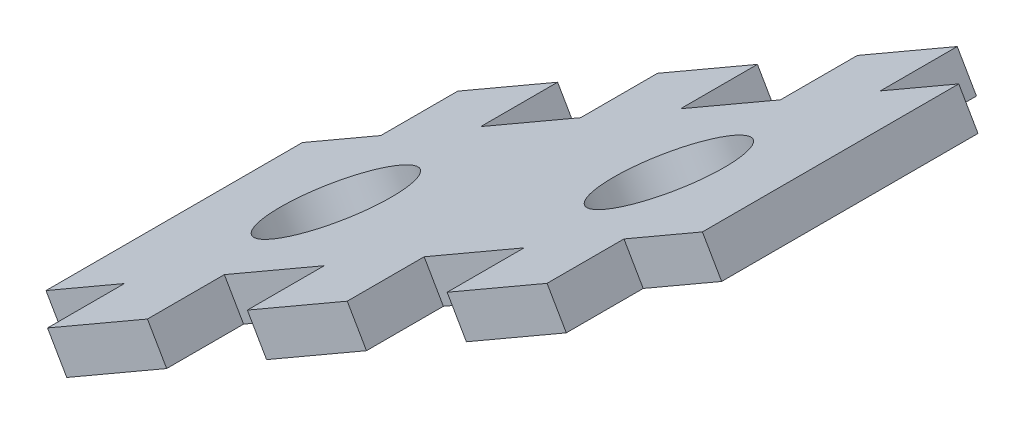
ISO-10303-21;
HEADER;
FILE_DESCRIPTION(('STEP AP214'),'2;1');
FILE_NAME('part.step','',(''),(''),'','','');
FILE_SCHEMA(('AUTOMOTIVE_DESIGN { 1 0 10303 214 1 1 1 1 }'));
ENDSEC;
DATA;
#1=APPLICATION_CONTEXT('core data for automotive mechanical design processes');
#2=APPLICATION_PROTOCOL_DEFINITION('international standard','automotive_design',2000,#1);
#3=PRODUCT_CONTEXT('',#1,'mechanical');
#4=PRODUCT('Part','Part','',(#3));
#5=PRODUCT_RELATED_PRODUCT_CATEGORY('part','',(#4));
#6=PRODUCT_DEFINITION_FORMATION('','',#4);
#7=PRODUCT_DEFINITION_CONTEXT('part definition',#1,'design');
#8=PRODUCT_DEFINITION('design','',#6,#7);
#9=PRODUCT_DEFINITION_SHAPE('','',#8);
#10=(LENGTH_UNIT() NAMED_UNIT(*) SI_UNIT(.MILLI.,.METRE.));
#11=(NAMED_UNIT(*) PLANE_ANGLE_UNIT() SI_UNIT($,.RADIAN.));
#12=(NAMED_UNIT(*) SI_UNIT($,.STERADIAN.) SOLID_ANGLE_UNIT());
#13=UNCERTAINTY_MEASURE_WITH_UNIT(LENGTH_MEASURE(1.E-05),#10,'distance_accuracy_value','');
#14=(GEOMETRIC_REPRESENTATION_CONTEXT(3) GLOBAL_UNCERTAINTY_ASSIGNED_CONTEXT((#13)) GLOBAL_UNIT_ASSIGNED_CONTEXT((#10,
#11,#12)) REPRESENTATION_CONTEXT('',''));
#15=CARTESIAN_POINT('',(0.,0.,0.));
#16=DIRECTION('',(0.,0.,1.));
#17=DIRECTION('',(1.,0.,0.));
#18=AXIS2_PLACEMENT_3D('',#15,#16,#17);
#19=CARTESIAN_POINT('',(0.,0.,0.));
#20=DIRECTION('',(0.,0.,1.));
#21=DIRECTION('',(1.,0.,0.));
#22=AXIS2_PLACEMENT_3D('',#19,#20,#21);
#23=PLANE('',#22);
#24=DIRECTION('',(0.500000000000002,-0.866025403784438,0.));
#25=VECTOR('',#24,1.);
#26=CARTESIAN_POINT('',(-139.580813944551,-80.5870205045939,0.));
#27=LINE('',#26,#25);
#28=CARTESIAN_POINT('',(-54.5936546228741,-227.789098440688,0.));
#29=VERTEX_POINT('',#28);
#30=CARTESIAN_POINT('',(-51.5936546228741,-232.985250863395,0.));
#31=VERTEX_POINT('',#30);
#32=EDGE_CURVE('E286',#29,#31,#27,.T.);
#33=ORIENTED_EDGE('',*,*,#32,.F.);
#34=DIRECTION('',(-0.866025403784438,-0.5,0.));
#35=VECTOR('',#34,1.);
#36=CARTESIAN_POINT('',(-82.4219374413873,-243.855765017042,0.));
#37=LINE('',#36,#35);
#38=CARTESIAN_POINT('',(-39.0051973547542,-218.789098440688,0.));
#39=VERTEX_POINT('',#38);
#40=EDGE_CURVE('E462',#39,#29,#37,.T.);
#41=ORIENTED_EDGE('',*,*,#40,.F.);
#42=DIRECTION('',(-0.500000000000001,0.866025403784438,0.));
#43=VECTOR('',#42,1.);
#44=CARTESIAN_POINT('',(-123.992356676431,-71.5870205045937,0.));
#45=LINE('',#44,#43);
#46=CARTESIAN_POINT('',(-36.0051973547542,-223.985250863395,0.));
#47=VERTEX_POINT('',#46);
#48=EDGE_CURVE('E333',#47,#39,#45,.T.);
#49=ORIENTED_EDGE('',*,*,#48,.F.);
#50=DIRECTION('',(0.866025403784439,0.5,0.));
#51=VECTOR('',#50,1.);
#52=CARTESIAN_POINT('',(-79.4219374413873,-249.051917439748,0.));
#53=LINE('',#52,#51);
#54=EDGE_CURVE('E54',#31,#47,#53,.T.);
#55=ORIENTED_EDGE('',*,*,#54,.F.);
#56=EDGE_LOOP('',(#33,#41,#49,#55));
#57=FACE_BOUND('',#56,.T.);
#58=ADVANCED_FACE('F39',(#57),#23,.F.);
#59=DIRECTION('',(-0.500000000000001,0.866025403784438,0.));
#60=VECTOR('',#59,1.);
#61=CARTESIAN_POINT('',(-155.169271212671,-89.5870205045936,0.));
#62=LINE('',#61,#60);
#63=CARTESIAN_POINT('',(-67.182111890994,-241.985250863395,0.));
#64=VERTEX_POINT('',#63);
#65=CARTESIAN_POINT('',(-70.182111890994,-236.789098440688,0.));
#66=VERTEX_POINT('',#65);
#67=EDGE_CURVE('E62',#64,#66,#62,.T.);
#68=ORIENTED_EDGE('',*,*,#67,.F.);
#69=CARTESIAN_POINT('',(-79.4219374413873,-249.051917439748,0.));
#70=VERTEX_POINT('',#69);
#71=EDGE_CURVE('E390',#70,#64,#53,.T.);
#72=ORIENTED_EDGE('',*,*,#71,.F.);
#73=DIRECTION('',(0.499999999999999,-0.866025403784439,0.));
#74=VECTOR('',#73,1.);
#75=CARTESIAN_POINT('',(-82.4219374413873,-243.855765017042,0.));
#76=LINE('',#75,#74);
#77=CARTESIAN_POINT('',(-82.4219374413873,-243.855765017042,0.));
#78=VERTEX_POINT('',#77);
#79=EDGE_CURVE('E393',#78,#70,#76,.T.);
#80=ORIENTED_EDGE('',*,*,#79,.F.);
#81=EDGE_CURVE('E384',#66,#78,#37,.T.);
#82=ORIENTED_EDGE('',*,*,#81,.F.);
#83=EDGE_LOOP('',(#68,#72,#80,#82));
#84=FACE_BOUND('',#83,.T.);
#85=ADVANCED_FACE('F473',(#84),#23,.F.);
#86=CARTESIAN_POINT('',(-1.78470181689456E-13,-160.,40.0000000000036));
#87=DIRECTION('',(0.,0.,1.));
#88=DIRECTION('',(-1.,0.,0.));
#89=AXIS2_PLACEMENT_3D('',#86,#87,#88);
#90=PLANE('',#89);
#91=DIRECTION('',(-0.866025403784439,-0.5,0.));
#92=VECTOR('',#91,1.);
#93=CARTESIAN_POINT('',(-82.4219374413872,-243.855765017042,40.0000000000035));
#94=LINE('',#93,#92);
#95=CARTESIAN_POINT('',(-39.0051973547542,-218.789098440688,40.0000000000035));
#96=VERTEX_POINT('',#95);
#97=CARTESIAN_POINT('',(-54.5936546228741,-227.789098440688,40.0000000000035));
#98=VERTEX_POINT('',#97);
#99=EDGE_CURVE('E426',#96,#98,#94,.T.);
#100=ORIENTED_EDGE('',*,*,#99,.T.);
#101=DIRECTION('',(0.500000000000002,-0.866025403784438,0.));
#102=VECTOR('',#101,1.);
#103=CARTESIAN_POINT('',(-70.2987816417955,-200.587020504594,40.0000000000035));
#104=LINE('',#103,#102);
#105=CARTESIAN_POINT('',(-51.5936546228741,-232.985250863395,40.0000000000035));
#106=VERTEX_POINT('',#105);
#107=EDGE_CURVE('E230',#98,#106,#104,.T.);
#108=ORIENTED_EDGE('',*,*,#107,.T.);
#109=DIRECTION('',(0.866025403784439,0.5,0.));
#110=VECTOR('',#109,1.);
#111=CARTESIAN_POINT('',(-79.4219374413872,-249.051917439748,40.0000000000035));
#112=LINE('',#111,#110);
#113=CARTESIAN_POINT('',(-36.0051973547542,-223.985250863395,40.0000000000035));
#114=VERTEX_POINT('',#113);
#115=EDGE_CURVE('E403',#106,#114,#112,.T.);
#116=ORIENTED_EDGE('',*,*,#115,.T.);
#117=DIRECTION('',(-0.500000000000001,0.866025403784438,0.));
#118=VECTOR('',#117,1.);
#119=CARTESIAN_POINT('',(-54.7103243736757,-191.587020504594,40.0000000000035));
#120=LINE('',#119,#118);
#121=EDGE_CURVE('E331',#114,#96,#120,.T.);
#122=ORIENTED_EDGE('',*,*,#121,.T.);
#123=EDGE_LOOP('',(#100,#108,#116,#122));
#124=FACE_BOUND('',#123,.T.);
#125=ADVANCED_FACE('F497',(#124),#90,.T.);
#126=CARTESIAN_POINT('',(-79.4219374413873,-249.051917439748,40.0000000000035));
#127=VERTEX_POINT('',#126);
#128=CARTESIAN_POINT('',(-67.182111890994,-241.985250863395,40.0000000000035));
#129=VERTEX_POINT('',#128);
#130=EDGE_CURVE('E400',#127,#129,#112,.T.);
#131=ORIENTED_EDGE('',*,*,#130,.T.);
#132=DIRECTION('',(-0.500000000000001,0.866025403784438,0.));
#133=VECTOR('',#132,1.);
#134=CARTESIAN_POINT('',(-85.8872389099154,-209.587020504594,40.0000000000035));
#135=LINE('',#134,#133);
#136=CARTESIAN_POINT('',(-70.182111890994,-236.789098440688,40.0000000000035));
#137=VERTEX_POINT('',#136);
#138=EDGE_CURVE('E281',#129,#137,#135,.T.);
#139=ORIENTED_EDGE('',*,*,#138,.T.);
#140=CARTESIAN_POINT('',(-82.4219374413873,-243.855765017042,40.0000000000035));
#141=VERTEX_POINT('',#140);
#142=EDGE_CURVE('E382',#137,#141,#94,.T.);
#143=ORIENTED_EDGE('',*,*,#142,.T.);
#144=DIRECTION('',(0.499999999999999,-0.866025403784439,0.));
#145=VECTOR('',#144,1.);
#146=CARTESIAN_POINT('',(-82.4219374413873,-243.855765017042,40.0000000000035));
#147=LINE('',#146,#145);
#148=EDGE_CURVE('E405',#141,#127,#147,.T.);
#149=ORIENTED_EDGE('',*,*,#148,.T.);
#150=EDGE_LOOP('',(#131,#139,#143,#149));
#151=FACE_BOUND('',#150,.T.);
#152=ADVANCED_FACE('F502',(#151),#90,.T.);
#153=DIRECTION('',(0.5,-0.866025403784439,0.));
#154=VECTOR('',#153,1.);
#155=CARTESIAN_POINT('',(-77.2269848720711,-44.5870205045934,0.));
#156=LINE('',#155,#154);
#157=CARTESIAN_POINT('',(7.76017444960544,-191.789098440688,0.));
#158=VERTEX_POINT('',#157);
#159=CARTESIAN_POINT('',(10.7601744496055,-196.985250863395,0.));
#160=VERTEX_POINT('',#159);
#161=EDGE_CURVE('E375',#158,#160,#156,.T.);
#162=ORIENTED_EDGE('',*,*,#161,.F.);
#163=CARTESIAN_POINT('',(19.9999999999987,-184.722431864335,0.));
#164=VERTEX_POINT('',#163);
#165=EDGE_CURVE('E379',#164,#158,#37,.T.);
#166=ORIENTED_EDGE('',*,*,#165,.F.);
#167=DIRECTION('',(-0.500000000000001,0.866025403784438,0.));
#168=VECTOR('',#167,1.);
#169=CARTESIAN_POINT('',(19.9999999999987,-184.722431864335,0.));
#170=LINE('',#169,#168);
#171=CARTESIAN_POINT('',(22.9999999999987,-189.918584287041,0.));
#172=VERTEX_POINT('',#171);
#173=EDGE_CURVE('E385',#172,#164,#170,.T.);
#174=ORIENTED_EDGE('',*,*,#173,.F.);
#175=EDGE_CURVE('E392',#160,#172,#53,.T.);
#176=ORIENTED_EDGE('',*,*,#175,.F.);
#177=EDGE_LOOP('',(#162,#166,#174,#176));
#178=FACE_BOUND('',#177,.T.);
#179=ADVANCED_FACE('F493',(#178),#23,.F.);
#180=CARTESIAN_POINT('',(-20.4167400866343,-214.985250863395,0.));
#181=VERTEX_POINT('',#180);
#182=CARTESIAN_POINT('',(-4.82828281851438,-205.985250863395,0.));
#183=VERTEX_POINT('',#182);
#184=EDGE_CURVE('E450',#181,#183,#53,.T.);
#185=ORIENTED_EDGE('',*,*,#184,.F.);
#186=DIRECTION('',(-0.499999999999999,0.866025403784439,0.));
#187=VECTOR('',#186,1.);
#188=CARTESIAN_POINT('',(-108.403899408311,-62.5870205045933,0.));
#189=LINE('',#188,#187);
#190=CARTESIAN_POINT('',(-23.4167400866343,-209.789098440688,0.));
#191=VERTEX_POINT('',#190);
#192=EDGE_CURVE('E328',#181,#191,#189,.T.);
#193=ORIENTED_EDGE('',*,*,#192,.T.);
#194=CARTESIAN_POINT('',(-7.82828281851439,-200.789098440688,0.));
#195=VERTEX_POINT('',#194);
#196=EDGE_CURVE('E383',#195,#191,#37,.T.);
#197=ORIENTED_EDGE('',*,*,#196,.F.);
#198=DIRECTION('',(-0.499999999999999,0.86602540378444,0.));
#199=VECTOR('',#198,1.);
#200=CARTESIAN_POINT('',(-92.8154421401909,-53.5870205045931,0.));
#201=LINE('',#200,#199);
#202=EDGE_CURVE('E361',#183,#195,#201,.T.);
#203=ORIENTED_EDGE('',*,*,#202,.F.);
#204=EDGE_LOOP('',(#185,#193,#197,#203));
#205=FACE_BOUND('',#204,.T.);
#206=ADVANCED_FACE('F498',(#205),#23,.F.);
#207=CARTESIAN_POINT('',(19.9999999999987,-184.722431864335,40.0000000000035));
#208=VERTEX_POINT('',#207);
#209=CARTESIAN_POINT('',(7.76017444960547,-191.789098440688,40.0000000000035));
#210=VERTEX_POINT('',#209);
#211=EDGE_CURVE('E408',#208,#210,#94,.T.);
#212=ORIENTED_EDGE('',*,*,#211,.T.);
#213=DIRECTION('',(0.5,-0.866025403784439,0.));
#214=VECTOR('',#213,1.);
#215=CARTESIAN_POINT('',(-7.944952569316,-164.587020504594,40.0000000000036));
#216=LINE('',#215,#214);
#217=CARTESIAN_POINT('',(10.7601744496055,-196.985250863395,40.0000000000035));
#218=VERTEX_POINT('',#217);
#219=EDGE_CURVE('E11',#210,#218,#216,.T.);
#220=ORIENTED_EDGE('',*,*,#219,.T.);
#221=CARTESIAN_POINT('',(22.9999999999987,-189.918584287041,40.0000000000036));
#222=VERTEX_POINT('',#221);
#223=EDGE_CURVE('E404',#218,#222,#112,.T.);
#224=ORIENTED_EDGE('',*,*,#223,.T.);
#225=DIRECTION('',(-0.500000000000001,0.866025403784438,0.));
#226=VECTOR('',#225,1.);
#227=CARTESIAN_POINT('',(19.9999999999987,-184.722431864335,40.0000000000036));
#228=LINE('',#227,#226);
#229=EDGE_CURVE('E397',#222,#208,#228,.T.);
#230=ORIENTED_EDGE('',*,*,#229,.T.);
#231=EDGE_LOOP('',(#212,#220,#224,#230));
#232=FACE_BOUND('',#231,.T.);
#233=ADVANCED_FACE('F41',(#232),#90,.T.);
#234=DIRECTION('',(-0.499999999999999,0.866025403784439,0.));
#235=VECTOR('',#234,1.);
#236=CARTESIAN_POINT('',(-39.1218671055558,-182.587020504593,40.0000000000035));
#237=LINE('',#236,#235);
#238=CARTESIAN_POINT('',(-20.4167400866343,-214.985250863395,40.0000000000035));
#239=VERTEX_POINT('',#238);
#240=CARTESIAN_POINT('',(-23.4167400866343,-209.789098440688,40.0000000000035));
#241=VERTEX_POINT('',#240);
#242=EDGE_CURVE('E325',#239,#241,#237,.T.);
#243=ORIENTED_EDGE('',*,*,#242,.F.);
#244=CARTESIAN_POINT('',(-4.8282828185144,-205.985250863395,40.0000000000035));
#245=VERTEX_POINT('',#244);
#246=EDGE_CURVE('E421',#239,#245,#112,.T.);
#247=ORIENTED_EDGE('',*,*,#246,.T.);
#248=DIRECTION('',(-0.499999999999999,0.86602540378444,0.));
#249=VECTOR('',#248,1.);
#250=CARTESIAN_POINT('',(-23.5334098374359,-173.587020504593,40.0000000000036));
#251=LINE('',#250,#249);
#252=CARTESIAN_POINT('',(-7.82828281851446,-200.789098440688,40.0000000000035));
#253=VERTEX_POINT('',#252);
#254=EDGE_CURVE('E47',#245,#253,#251,.T.);
#255=ORIENTED_EDGE('',*,*,#254,.T.);
#256=EDGE_CURVE('E410',#253,#241,#94,.T.);
#257=ORIENTED_EDGE('',*,*,#256,.T.);
#258=EDGE_LOOP('',(#243,#247,#255,#257));
#259=FACE_BOUND('',#258,.T.);
#260=ADVANCED_FACE('F419',(#259),#90,.T.);
#261=CARTESIAN_POINT('',(-82.4219374413873,-243.855765017042,163.499261569832));
#262=DIRECTION('',(0.866025403784439,0.499999999999999,0.));
#263=DIRECTION('',(-0.499999999999999,0.866025403784439,0.));
#264=AXIS2_PLACEMENT_3D('',#261,#262,#263);
#265=PLANE('',#264);
#266=ORIENTED_EDGE('',*,*,#148,.F.);
#267=DIRECTION('',(0.,0.,-1.));
#268=VECTOR('',#267,1.);
#269=CARTESIAN_POINT('',(-82.4219374413873,-243.855765017042,163.499261569832));
#270=LINE('',#269,#268);
#271=EDGE_CURVE('E378',#141,#78,#270,.T.);
#272=ORIENTED_EDGE('',*,*,#271,.T.);
#273=ORIENTED_EDGE('',*,*,#79,.T.);
#274=DIRECTION('',(0.,0.,-1.));
#275=VECTOR('',#274,1.);
#276=CARTESIAN_POINT('',(-79.4219374413873,-249.051917439748,163.499261569832));
#277=LINE('',#276,#275);
#278=EDGE_CURVE('E396',#127,#70,#277,.T.);
#279=ORIENTED_EDGE('',*,*,#278,.F.);
#280=EDGE_LOOP('',(#266,#272,#273,#279));
#281=FACE_BOUND('',#280,.T.);
#282=ADVANCED_FACE('F471',(#281),#265,.F.);
#283=CARTESIAN_POINT('',(-79.4219374413873,-249.051917439748,163.499261569832));
#284=DIRECTION('',(-0.5,0.866025403784439,0.));
#285=DIRECTION('',(-0.866025403784439,-0.5,0.));
#286=AXIS2_PLACEMENT_3D('',#283,#284,#285);
#287=PLANE('',#286);
#288=CARTESIAN_POINT('',(-54.1917308342274,-234.485250863395,20.0000000000001));
#289=DIRECTION('',(-0.5,0.866025403784439,0.));
#290=DIRECTION('',(-0.866025403784439,-0.5,0.));
#291=AXIS2_PLACEMENT_3D('',#288,#289,#290);
#292=CIRCLE('',#291,9.99999999999999);
#293=CARTESIAN_POINT('',(-62.8519848720718,-239.485250863395,20.0000000000001));
#294=VERTEX_POINT('',#293);
#295=EDGE_CURVE('E251',#294,#294,#292,.T.);
#296=ORIENTED_EDGE('',*,*,#295,.T.);
#297=EDGE_LOOP('',(#296));
#298=FACE_BOUND('',#297,.T.);
#299=CARTESIAN_POINT('',(-2.23020660716112,-204.485250863395,20.0000000000001));
#300=DIRECTION('',(-0.5,0.866025403784439,0.));
#301=DIRECTION('',(-0.866025403784439,-0.5,0.));
#302=AXIS2_PLACEMENT_3D('',#299,#300,#301);
#303=CIRCLE('',#302,9.99999999999999);
#304=CARTESIAN_POINT('',(-10.8904606450055,-209.485250863395,20.0000000000001));
#305=VERTEX_POINT('',#304);
#306=EDGE_CURVE('E254',#305,#305,#303,.T.);
#307=ORIENTED_EDGE('',*,*,#306,.T.);
#308=EDGE_LOOP('',(#307));
#309=FACE_BOUND('',#308,.T.);
#310=ORIENTED_EDGE('',*,*,#71,.T.);
#311=DIRECTION('',(0.,0.,1.));
#312=VECTOR('',#311,1.);
#313=CARTESIAN_POINT('',(-67.182111890994,-241.985250863395,-12.));
#314=LINE('',#313,#312);
#315=CARTESIAN_POINT('',(-67.182111890994,-241.985250863395,-12.));
#316=VERTEX_POINT('',#315);
#317=EDGE_CURVE('E274',#316,#64,#314,.T.);
#318=ORIENTED_EDGE('',*,*,#317,.F.);
#319=DIRECTION('',(-0.866025403784439,-0.5,0.));
#320=VECTOR('',#319,1.);
#321=CARTESIAN_POINT('',(87.9871593216766,-152.398230358801,-12.));
#322=LINE('',#321,#320);
#323=CARTESIAN_POINT('',(-51.5936546228741,-232.985250863395,-12.));
#324=VERTEX_POINT('',#323);
#325=EDGE_CURVE('E266',#324,#316,#322,.T.);
#326=ORIENTED_EDGE('',*,*,#325,.F.);
#327=DIRECTION('',(0.,0.,1.));
#328=VECTOR('',#327,1.);
#329=CARTESIAN_POINT('',(-51.5936546228741,-232.985250863395,-12.));
#330=LINE('',#329,#328);
#331=EDGE_CURVE('E236',#324,#31,#330,.T.);
#332=ORIENTED_EDGE('',*,*,#331,.T.);
#333=ORIENTED_EDGE('',*,*,#54,.T.);
#334=DIRECTION('',(0.,0.,1.));
#335=VECTOR('',#334,1.);
#336=CARTESIAN_POINT('',(-36.0051973547542,-223.985250863395,-12.));
#337=LINE('',#336,#335);
#338=CARTESIAN_POINT('',(-36.0051973547542,-223.985250863395,-12.));
#339=VERTEX_POINT('',#338);
#340=EDGE_CURVE('E322',#339,#47,#337,.T.);
#341=ORIENTED_EDGE('',*,*,#340,.F.);
#342=DIRECTION('',(-0.866025403784439,-0.5,0.));
#343=VECTOR('',#342,1.);
#344=CARTESIAN_POINT('',(87.9871593216766,-152.398230358801,-12.));
#345=LINE('',#344,#343);
#346=CARTESIAN_POINT('',(-20.4167400866343,-214.985250863395,-12.));
#347=VERTEX_POINT('',#346);
#348=EDGE_CURVE('E300',#347,#339,#345,.T.);
#349=ORIENTED_EDGE('',*,*,#348,.F.);
#350=DIRECTION('',(0.,0.,1.));
#351=VECTOR('',#350,1.);
#352=CARTESIAN_POINT('',(-20.4167400866343,-214.985250863395,-12.));
#353=LINE('',#352,#351);
#354=EDGE_CURVE('E311',#347,#181,#353,.T.);
#355=ORIENTED_EDGE('',*,*,#354,.T.);
#356=ORIENTED_EDGE('',*,*,#184,.T.);
#357=DIRECTION('',(0.,0.,-1.));
#358=VECTOR('',#357,1.);
#359=CARTESIAN_POINT('',(-4.82828281851438,-205.985250863395,52.));
#360=LINE('',#359,#358);
#361=CARTESIAN_POINT('',(-4.82828281851438,-205.985250863395,-12.));
#362=VERTEX_POINT('',#361);
#363=EDGE_CURVE('E370',#183,#362,#360,.T.);
#364=ORIENTED_EDGE('',*,*,#363,.T.);
#365=DIRECTION('',(-0.866025403784439,-0.5,0.));
#366=VECTOR('',#365,1.);
#367=CARTESIAN_POINT('',(87.9871593216766,-152.398230358801,-12.));
#368=LINE('',#367,#366);
#369=CARTESIAN_POINT('',(10.7601744496055,-196.985250863395,-12.));
#370=VERTEX_POINT('',#369);
#371=EDGE_CURVE('E338',#370,#362,#368,.T.);
#372=ORIENTED_EDGE('',*,*,#371,.F.);
#373=DIRECTION('',(0.,0.,-1.));
#374=VECTOR('',#373,1.);
#375=CARTESIAN_POINT('',(10.7601744496055,-196.985250863395,52.));
#376=LINE('',#375,#374);
#377=EDGE_CURVE('E357',#160,#370,#376,.T.);
#378=ORIENTED_EDGE('',*,*,#377,.F.);
#379=ORIENTED_EDGE('',*,*,#175,.T.);
#380=DIRECTION('',(0.,0.,-1.));
#381=VECTOR('',#380,1.);
#382=CARTESIAN_POINT('',(22.9999999999987,-189.918584287041,163.499261569832));
#383=LINE('',#382,#381);
#384=EDGE_CURVE('E389',#222,#172,#383,.T.);
#385=ORIENTED_EDGE('',*,*,#384,.F.);
#386=ORIENTED_EDGE('',*,*,#223,.F.);
#387=CARTESIAN_POINT('',(10.7601744496055,-196.985250863395,52.));
#388=VERTEX_POINT('',#387);
#389=EDGE_CURVE('E371',#388,#218,#376,.T.);
#390=ORIENTED_EDGE('',*,*,#389,.F.);
#391=DIRECTION('',(-0.866025403784439,-0.5,0.));
#392=VECTOR('',#391,1.);
#393=CARTESIAN_POINT('',(87.9871593216766,-152.398230358801,52.));
#394=LINE('',#393,#392);
#395=CARTESIAN_POINT('',(-4.82828281851438,-205.985250863395,52.));
#396=VERTEX_POINT('',#395);
#397=EDGE_CURVE('E349',#388,#396,#394,.T.);
#398=ORIENTED_EDGE('',*,*,#397,.T.);
#399=EDGE_CURVE('E367',#396,#245,#360,.T.);
#400=ORIENTED_EDGE('',*,*,#399,.T.);
#401=ORIENTED_EDGE('',*,*,#246,.F.);
#402=CARTESIAN_POINT('',(-20.4167400866343,-214.985250863395,52.));
#403=VERTEX_POINT('',#402);
#404=EDGE_CURVE('E310',#239,#403,#353,.T.);
#405=ORIENTED_EDGE('',*,*,#404,.T.);
#406=DIRECTION('',(-0.866025403784439,-0.5,0.));
#407=VECTOR('',#406,1.);
#408=CARTESIAN_POINT('',(87.9871593216766,-152.398230358801,52.));
#409=LINE('',#408,#407);
#410=CARTESIAN_POINT('',(-36.0051973547542,-223.985250863395,52.));
#411=VERTEX_POINT('',#410);
#412=EDGE_CURVE('E288',#403,#411,#409,.T.);
#413=ORIENTED_EDGE('',*,*,#412,.T.);
#414=EDGE_CURVE('E321',#114,#411,#337,.T.);
#415=ORIENTED_EDGE('',*,*,#414,.F.);
#416=ORIENTED_EDGE('',*,*,#115,.F.);
#417=CARTESIAN_POINT('',(-51.5936546228741,-232.985250863395,52.));
#418=VERTEX_POINT('',#417);
#419=EDGE_CURVE('E277',#106,#418,#330,.T.);
#420=ORIENTED_EDGE('',*,*,#419,.T.);
#421=DIRECTION('',(-0.866025403784439,-0.5,0.));
#422=VECTOR('',#421,1.);
#423=CARTESIAN_POINT('',(87.9871593216766,-152.398230358801,52.));
#424=LINE('',#423,#422);
#425=CARTESIAN_POINT('',(-67.182111890994,-241.985250863395,52.));
#426=VERTEX_POINT('',#425);
#427=EDGE_CURVE('E246',#418,#426,#424,.T.);
#428=ORIENTED_EDGE('',*,*,#427,.T.);
#429=EDGE_CURVE('E273',#129,#426,#314,.T.);
#430=ORIENTED_EDGE('',*,*,#429,.F.);
#431=ORIENTED_EDGE('',*,*,#130,.F.);
#432=ORIENTED_EDGE('',*,*,#278,.T.);
#433=EDGE_LOOP('',(#310,#318,#326,#332,#333,#341,#349,#355,#356,#364,#372,#378,#379,#385,#386,
#390,#398,#400,#401,#405,#413,#415,#416,#420,#428,#430,#431,#432));
#434=FACE_BOUND('',#433,.T.);
#435=ADVANCED_FACE('F445',(#298,#309,#434),#287,.F.);
#436=CARTESIAN_POINT('',(19.9999999999987,-184.722431864335,163.499261569832));
#437=DIRECTION('',(-0.866025403784438,-0.500000000000001,0.));
#438=DIRECTION('',(0.500000000000001,-0.866025403784438,0.));
#439=AXIS2_PLACEMENT_3D('',#436,#437,#438);
#440=PLANE('',#439);
#441=ORIENTED_EDGE('',*,*,#229,.F.);
#442=ORIENTED_EDGE('',*,*,#384,.T.);
#443=ORIENTED_EDGE('',*,*,#173,.T.);
#444=DIRECTION('',(0.,0.,-1.));
#445=VECTOR('',#444,1.);
#446=CARTESIAN_POINT('',(19.9999999999987,-184.722431864335,163.499261569832));
#447=LINE('',#446,#445);
#448=EDGE_CURVE('E388',#208,#164,#447,.T.);
#449=ORIENTED_EDGE('',*,*,#448,.F.);
#450=EDGE_LOOP('',(#441,#442,#443,#449));
#451=FACE_BOUND('',#450,.T.);
#452=ADVANCED_FACE('F442',(#451),#440,.F.);
#453=CARTESIAN_POINT('',(-82.4219374413873,-243.855765017042,163.499261569832));
#454=DIRECTION('',(0.5,-0.866025403784438,0.));
#455=DIRECTION('',(0.866025403784439,0.5,0.));
#456=AXIS2_PLACEMENT_3D('',#453,#454,#455);
#457=PLANE('',#456);
#458=CARTESIAN_POINT('',(-57.1917308342274,-229.289098440688,20.0000000000001));
#459=DIRECTION('',(-0.5,0.866025403784438,0.));
#460=DIRECTION('',(-0.866025403784438,-0.5,0.));
#461=AXIS2_PLACEMENT_3D('',#458,#459,#460);
#462=CIRCLE('',#461,9.99999999999999);
#463=CARTESIAN_POINT('',(-65.8519848720718,-234.289098440688,20.0000000000001));
#464=VERTEX_POINT('',#463);
#465=EDGE_CURVE('E932',#464,#464,#462,.T.);
#466=ORIENTED_EDGE('',*,*,#465,.F.);
#467=EDGE_LOOP('',(#466));
#468=FACE_BOUND('',#467,.T.);
#469=CARTESIAN_POINT('',(-5.23020660716109,-199.289098440688,20.0000000000001));
#470=DIRECTION('',(-0.5,0.866025403784438,0.));
#471=DIRECTION('',(-0.866025403784438,-0.5,0.));
#472=AXIS2_PLACEMENT_3D('',#469,#470,#471);
#473=CIRCLE('',#472,9.99999999999999);
#474=CARTESIAN_POINT('',(-13.8904606450055,-204.289098440688,20.0000000000001));
#475=VERTEX_POINT('',#474);
#476=EDGE_CURVE('E938',#475,#475,#473,.T.);
#477=ORIENTED_EDGE('',*,*,#476,.F.);
#478=EDGE_LOOP('',(#477));
#479=FACE_BOUND('',#478,.T.);
#480=ORIENTED_EDGE('',*,*,#142,.F.);
#481=DIRECTION('',(0.,0.,1.));
#482=VECTOR('',#481,1.);
#483=CARTESIAN_POINT('',(-70.182111890994,-236.789098440688,-12.));
#484=LINE('',#483,#482);
#485=CARTESIAN_POINT('',(-70.182111890994,-236.789098440688,52.));
#486=VERTEX_POINT('',#485);
#487=EDGE_CURVE('E250',#137,#486,#484,.T.);
#488=ORIENTED_EDGE('',*,*,#487,.T.);
#489=DIRECTION('',(0.866025403784439,0.5,0.));
#490=VECTOR('',#489,1.);
#491=CARTESIAN_POINT('',(84.9871593216766,-147.202077936095,52.));
#492=LINE('',#491,#490);
#493=CARTESIAN_POINT('',(-54.5936546228741,-227.789098440688,52.));
#494=VERTEX_POINT('',#493);
#495=EDGE_CURVE('E243',#486,#494,#492,.T.);
#496=ORIENTED_EDGE('',*,*,#495,.T.);
#497=DIRECTION('',(0.,0.,1.));
#498=VECTOR('',#497,1.);
#499=CARTESIAN_POINT('',(-54.5936546228741,-227.789098440688,-12.));
#500=LINE('',#499,#498);
#501=EDGE_CURVE('E225',#98,#494,#500,.T.);
#502=ORIENTED_EDGE('',*,*,#501,.F.);
#503=ORIENTED_EDGE('',*,*,#99,.F.);
#504=DIRECTION('',(0.,0.,1.));
#505=VECTOR('',#504,1.);
#506=CARTESIAN_POINT('',(-39.0051973547542,-218.789098440688,-12.));
#507=LINE('',#506,#505);
#508=CARTESIAN_POINT('',(-39.0051973547542,-218.789098440688,52.));
#509=VERTEX_POINT('',#508);
#510=EDGE_CURVE('E317',#96,#509,#507,.T.);
#511=ORIENTED_EDGE('',*,*,#510,.T.);
#512=DIRECTION('',(0.866025403784439,0.5,0.));
#513=VECTOR('',#512,1.);
#514=CARTESIAN_POINT('',(84.9871593216766,-147.202077936095,52.));
#515=LINE('',#514,#513);
#516=CARTESIAN_POINT('',(-23.4167400866343,-209.789098440688,52.));
#517=VERTEX_POINT('',#516);
#518=EDGE_CURVE('E294',#509,#517,#515,.T.);
#519=ORIENTED_EDGE('',*,*,#518,.T.);
#520=DIRECTION('',(0.,0.,1.));
#521=VECTOR('',#520,1.);
#522=CARTESIAN_POINT('',(-23.4167400866343,-209.789098440688,-12.));
#523=LINE('',#522,#521);
#524=EDGE_CURVE('E314',#241,#517,#523,.T.);
#525=ORIENTED_EDGE('',*,*,#524,.F.);
#526=ORIENTED_EDGE('',*,*,#256,.F.);
#527=DIRECTION('',(0.,0.,-1.));
#528=VECTOR('',#527,1.);
#529=CARTESIAN_POINT('',(-7.82828281851439,-200.789098440688,52.));
#530=LINE('',#529,#528);
#531=CARTESIAN_POINT('',(-7.82828281851439,-200.789098440688,52.));
#532=VERTEX_POINT('',#531);
#533=EDGE_CURVE('E363',#532,#253,#530,.T.);
#534=ORIENTED_EDGE('',*,*,#533,.F.);
#535=DIRECTION('',(0.866025403784439,0.5,0.));
#536=VECTOR('',#535,1.);
#537=CARTESIAN_POINT('',(84.9871593216766,-147.202077936095,52.));
#538=LINE('',#537,#536);
#539=CARTESIAN_POINT('',(7.76017444960544,-191.789098440688,52.));
#540=VERTEX_POINT('',#539);
#541=EDGE_CURVE('E354',#532,#540,#538,.T.);
#542=ORIENTED_EDGE('',*,*,#541,.T.);
#543=DIRECTION('',(0.,0.,-1.));
#544=VECTOR('',#543,1.);
#545=CARTESIAN_POINT('',(7.76017444960544,-191.789098440688,52.));
#546=LINE('',#545,#544);
#547=EDGE_CURVE('E358',#540,#210,#546,.T.);
#548=ORIENTED_EDGE('',*,*,#547,.T.);
#549=ORIENTED_EDGE('',*,*,#211,.F.);
#550=ORIENTED_EDGE('',*,*,#448,.T.);
#551=ORIENTED_EDGE('',*,*,#165,.T.);
#552=CARTESIAN_POINT('',(7.76017444960544,-191.789098440688,-12.));
#553=VERTEX_POINT('',#552);
#554=EDGE_CURVE('E362',#158,#553,#546,.T.);
#555=ORIENTED_EDGE('',*,*,#554,.T.);
#556=DIRECTION('',(0.866025403784439,0.5,0.));
#557=VECTOR('',#556,1.);
#558=CARTESIAN_POINT('',(84.9871593216766,-147.202077936095,-12.));
#559=LINE('',#558,#557);
#560=CARTESIAN_POINT('',(-7.82828281851439,-200.789098440688,-12.));
#561=VERTEX_POINT('',#560);
#562=EDGE_CURVE('E344',#561,#553,#559,.T.);
#563=ORIENTED_EDGE('',*,*,#562,.F.);
#564=EDGE_CURVE('E366',#195,#561,#530,.T.);
#565=ORIENTED_EDGE('',*,*,#564,.F.);
#566=ORIENTED_EDGE('',*,*,#196,.T.);
#567=CARTESIAN_POINT('',(-23.4167400866343,-209.789098440688,-12.));
#568=VERTEX_POINT('',#567);
#569=EDGE_CURVE('E315',#568,#191,#523,.T.);
#570=ORIENTED_EDGE('',*,*,#569,.F.);
#571=DIRECTION('',(0.866025403784439,0.5,0.));
#572=VECTOR('',#571,1.);
#573=CARTESIAN_POINT('',(84.9871593216766,-147.202077936095,-12.));
#574=LINE('',#573,#572);
#575=CARTESIAN_POINT('',(-39.0051973547542,-218.789098440688,-12.));
#576=VERTEX_POINT('',#575);
#577=EDGE_CURVE('E305',#576,#568,#574,.T.);
#578=ORIENTED_EDGE('',*,*,#577,.F.);
#579=EDGE_CURVE('E318',#576,#39,#507,.T.);
#580=ORIENTED_EDGE('',*,*,#579,.T.);
#581=ORIENTED_EDGE('',*,*,#40,.T.);
#582=CARTESIAN_POINT('',(-54.5936546228741,-227.789098440688,-12.));
#583=VERTEX_POINT('',#582);
#584=EDGE_CURVE('E235',#583,#29,#500,.T.);
#585=ORIENTED_EDGE('',*,*,#584,.F.);
#586=DIRECTION('',(0.866025403784439,0.5,0.));
#587=VECTOR('',#586,1.);
#588=CARTESIAN_POINT('',(84.9871593216766,-147.202077936095,-12.));
#589=LINE('',#588,#587);
#590=CARTESIAN_POINT('',(-70.182111890994,-236.789098440688,-12.));
#591=VERTEX_POINT('',#590);
#592=EDGE_CURVE('E261',#591,#583,#589,.T.);
#593=ORIENTED_EDGE('',*,*,#592,.F.);
#594=EDGE_CURVE('E270',#591,#66,#484,.T.);
#595=ORIENTED_EDGE('',*,*,#594,.T.);
#596=ORIENTED_EDGE('',*,*,#81,.T.);
#597=ORIENTED_EDGE('',*,*,#271,.F.);
#598=EDGE_LOOP('',(#480,#488,#496,#502,#503,#511,#519,#525,#526,#534,#542,#548,#549,#550,#551,
#555,#563,#565,#566,#570,#578,#580,#581,#585,#593,#595,#596,#597));
#599=FACE_BOUND('',#598,.T.);
#600=ADVANCED_FACE('F249',(#468,#479,#599),#457,.F.);
#601=CARTESIAN_POINT('',(0.,0.,52.));
#602=DIRECTION('',(0.,0.,-1.));
#603=DIRECTION('',(-1.,0.,0.));
#604=AXIS2_PLACEMENT_3D('',#601,#602,#603);
#605=PLANE('',#604);
#606=DIRECTION('',(-0.5,0.866025403784439,0.));
#607=VECTOR('',#606,1.);
#608=CARTESIAN_POINT('',(-77.2269848720711,-44.5870205045934,52.));
#609=LINE('',#608,#607);
#610=EDGE_CURVE('E347',#388,#540,#609,.T.);
#611=ORIENTED_EDGE('',*,*,#610,.T.);
#612=ORIENTED_EDGE('',*,*,#541,.F.);
#613=DIRECTION('',(0.499999999999999,-0.86602540378444,0.));
#614=VECTOR('',#613,1.);
#615=CARTESIAN_POINT('',(-92.8154421401909,-53.5870205045931,52.));
#616=LINE('',#615,#614);
#617=EDGE_CURVE('E352',#532,#396,#616,.T.);
#618=ORIENTED_EDGE('',*,*,#617,.T.);
#619=ORIENTED_EDGE('',*,*,#397,.F.);
#620=EDGE_LOOP('',(#611,#612,#618,#619));
#621=FACE_BOUND('',#620,.T.);
#622=ADVANCED_FACE('F431',(#621),#605,.F.);
#623=CARTESIAN_POINT('',(-92.8154421401909,-53.5870205045931,52.));
#624=DIRECTION('',(0.866025403784439,0.499999999999999,0.));
#625=DIRECTION('',(-0.499999999999999,0.86602540378444,0.));
#626=AXIS2_PLACEMENT_3D('',#623,#624,#625);
#627=PLANE('',#626);
#628=ORIENTED_EDGE('',*,*,#254,.F.);
#629=ORIENTED_EDGE('',*,*,#399,.F.);
#630=ORIENTED_EDGE('',*,*,#617,.F.);
#631=ORIENTED_EDGE('',*,*,#533,.T.);
#632=EDGE_LOOP('',(#628,#629,#630,#631));
#633=FACE_BOUND('',#632,.T.);
#634=ADVANCED_FACE('F427',(#633),#627,.F.);
#635=CARTESIAN_POINT('',(-77.2269848720711,-44.5870205045934,52.));
#636=DIRECTION('',(-0.866025403784439,-0.5,0.));
#637=DIRECTION('',(0.5,-0.866025403784439,0.));
#638=AXIS2_PLACEMENT_3D('',#635,#636,#637);
#639=PLANE('',#638);
#640=ORIENTED_EDGE('',*,*,#219,.F.);
#641=ORIENTED_EDGE('',*,*,#547,.F.);
#642=ORIENTED_EDGE('',*,*,#610,.F.);
#643=ORIENTED_EDGE('',*,*,#389,.T.);
#644=EDGE_LOOP('',(#640,#641,#642,#643));
#645=FACE_BOUND('',#644,.T.);
#646=ADVANCED_FACE('F437',(#645),#639,.F.);
#647=ORIENTED_EDGE('',*,*,#554,.F.);
#648=ORIENTED_EDGE('',*,*,#161,.T.);
#649=ORIENTED_EDGE('',*,*,#377,.T.);
#650=DIRECTION('',(-0.5,0.866025403784439,0.));
#651=VECTOR('',#650,1.);
#652=CARTESIAN_POINT('',(-77.2269848720711,-44.5870205045934,-12.));
#653=LINE('',#652,#651);
#654=EDGE_CURVE('E335',#370,#553,#653,.T.);
#655=ORIENTED_EDGE('',*,*,#654,.T.);
#656=EDGE_LOOP('',(#647,#648,#649,#655));
#657=FACE_BOUND('',#656,.T.);
#658=ADVANCED_FACE('F517',(#657),#639,.F.);
#659=ORIENTED_EDGE('',*,*,#363,.F.);
#660=ORIENTED_EDGE('',*,*,#202,.T.);
#661=ORIENTED_EDGE('',*,*,#564,.T.);
#662=DIRECTION('',(0.499999999999999,-0.86602540378444,0.));
#663=VECTOR('',#662,1.);
#664=CARTESIAN_POINT('',(-92.8154421401909,-53.5870205045931,-12.));
#665=LINE('',#664,#663);
#666=EDGE_CURVE('E341',#561,#362,#665,.T.);
#667=ORIENTED_EDGE('',*,*,#666,.T.);
#668=EDGE_LOOP('',(#659,#660,#661,#667));
#669=FACE_BOUND('',#668,.T.);
#670=ADVANCED_FACE('F519',(#669),#627,.F.);
#671=CARTESIAN_POINT('',(0.,0.,-12.));
#672=DIRECTION('',(0.,0.,-1.));
#673=DIRECTION('',(-1.,0.,0.));
#674=AXIS2_PLACEMENT_3D('',#671,#672,#673);
#675=PLANE('',#674);
#676=ORIENTED_EDGE('',*,*,#654,.F.);
#677=ORIENTED_EDGE('',*,*,#371,.T.);
#678=ORIENTED_EDGE('',*,*,#666,.F.);
#679=ORIENTED_EDGE('',*,*,#562,.T.);
#680=EDGE_LOOP('',(#676,#677,#678,#679));
#681=FACE_BOUND('',#680,.T.);
#682=ADVANCED_FACE('F516',(#681),#675,.T.);
#683=CARTESIAN_POINT('',(0.,0.,52.));
#684=DIRECTION('',(0.,0.,-1.));
#685=DIRECTION('',(-1.,0.,0.));
#686=AXIS2_PLACEMENT_3D('',#683,#684,#685);
#687=PLANE('',#686);
#688=ORIENTED_EDGE('',*,*,#412,.F.);
#689=DIRECTION('',(-0.499999999999999,0.866025403784439,0.));
#690=VECTOR('',#689,1.);
#691=CARTESIAN_POINT('',(-108.403899408311,-62.5870205045933,52.));
#692=LINE('',#691,#690);
#693=EDGE_CURVE('E297',#403,#517,#692,.T.);
#694=ORIENTED_EDGE('',*,*,#693,.T.);
#695=ORIENTED_EDGE('',*,*,#518,.F.);
#696=DIRECTION('',(-0.500000000000001,0.866025403784438,0.));
#697=VECTOR('',#696,1.);
#698=CARTESIAN_POINT('',(-123.992356676431,-71.5870205045937,52.));
#699=LINE('',#698,#697);
#700=EDGE_CURVE('E291',#411,#509,#699,.T.);
#701=ORIENTED_EDGE('',*,*,#700,.F.);
#702=EDGE_LOOP('',(#688,#694,#695,#701));
#703=FACE_BOUND('',#702,.T.);
#704=ADVANCED_FACE('F538',(#703),#687,.F.);
#705=CARTESIAN_POINT('',(-108.403899408311,-62.5870205045933,-12.));
#706=DIRECTION('',(0.866025403784439,0.499999999999999,0.));
#707=DIRECTION('',(-0.499999999999999,0.866025403784439,0.));
#708=AXIS2_PLACEMENT_3D('',#705,#706,#707);
#709=PLANE('',#708);
#710=ORIENTED_EDGE('',*,*,#404,.F.);
#711=ORIENTED_EDGE('',*,*,#242,.T.);
#712=ORIENTED_EDGE('',*,*,#524,.T.);
#713=ORIENTED_EDGE('',*,*,#693,.F.);
#714=EDGE_LOOP('',(#710,#711,#712,#713));
#715=FACE_BOUND('',#714,.T.);
#716=ADVANCED_FACE('F537',(#715),#709,.T.);
#717=CARTESIAN_POINT('',(-123.992356676431,-71.5870205045937,-12.));
#718=DIRECTION('',(0.866025403784438,0.500000000000001,0.));
#719=DIRECTION('',(-0.500000000000001,0.866025403784438,0.));
#720=AXIS2_PLACEMENT_3D('',#717,#718,#719);
#721=PLANE('',#720);
#722=ORIENTED_EDGE('',*,*,#121,.F.);
#723=ORIENTED_EDGE('',*,*,#414,.T.);
#724=ORIENTED_EDGE('',*,*,#700,.T.);
#725=ORIENTED_EDGE('',*,*,#510,.F.);
#726=EDGE_LOOP('',(#722,#723,#724,#725));
#727=FACE_BOUND('',#726,.T.);
#728=ADVANCED_FACE('F541',(#727),#721,.F.);
#729=ORIENTED_EDGE('',*,*,#340,.T.);
#730=ORIENTED_EDGE('',*,*,#48,.T.);
#731=ORIENTED_EDGE('',*,*,#579,.F.);
#732=DIRECTION('',(-0.500000000000001,0.866025403784438,0.));
#733=VECTOR('',#732,1.);
#734=CARTESIAN_POINT('',(-123.992356676431,-71.5870205045937,-12.));
#735=LINE('',#734,#733);
#736=EDGE_CURVE('E303',#339,#576,#735,.T.);
#737=ORIENTED_EDGE('',*,*,#736,.F.);
#738=EDGE_LOOP('',(#729,#730,#731,#737));
#739=FACE_BOUND('',#738,.T.);
#740=ADVANCED_FACE('F458',(#739),#721,.F.);
#741=ORIENTED_EDGE('',*,*,#192,.F.);
#742=ORIENTED_EDGE('',*,*,#354,.F.);
#743=DIRECTION('',(-0.499999999999999,0.866025403784439,0.));
#744=VECTOR('',#743,1.);
#745=CARTESIAN_POINT('',(-108.403899408311,-62.5870205045933,-12.));
#746=LINE('',#745,#744);
#747=EDGE_CURVE('E307',#347,#568,#746,.T.);
#748=ORIENTED_EDGE('',*,*,#747,.T.);
#749=ORIENTED_EDGE('',*,*,#569,.T.);
#750=EDGE_LOOP('',(#741,#742,#748,#749));
#751=FACE_BOUND('',#750,.T.);
#752=ADVANCED_FACE('F524',(#751),#709,.T.);
#753=CARTESIAN_POINT('',(0.,0.,-12.));
#754=DIRECTION('',(0.,0.,-1.));
#755=DIRECTION('',(-1.,0.,0.));
#756=AXIS2_PLACEMENT_3D('',#753,#754,#755);
#757=PLANE('',#756);
#758=ORIENTED_EDGE('',*,*,#348,.T.);
#759=ORIENTED_EDGE('',*,*,#736,.T.);
#760=ORIENTED_EDGE('',*,*,#577,.T.);
#761=ORIENTED_EDGE('',*,*,#747,.F.);
#762=EDGE_LOOP('',(#758,#759,#760,#761));
#763=FACE_BOUND('',#762,.T.);
#764=ADVANCED_FACE('F527',(#763),#757,.T.);
#765=CARTESIAN_POINT('',(0.,0.,52.));
#766=DIRECTION('',(0.,0.,-1.));
#767=DIRECTION('',(-1.,0.,0.));
#768=AXIS2_PLACEMENT_3D('',#765,#766,#767);
#769=PLANE('',#768);
#770=ORIENTED_EDGE('',*,*,#495,.F.);
#771=DIRECTION('',(-0.500000000000001,0.866025403784438,0.));
#772=VECTOR('',#771,1.);
#773=CARTESIAN_POINT('',(-155.169271212671,-89.5870205045936,52.));
#774=LINE('',#773,#772);
#775=EDGE_CURVE('E259',#426,#486,#774,.T.);
#776=ORIENTED_EDGE('',*,*,#775,.F.);
#777=ORIENTED_EDGE('',*,*,#427,.F.);
#778=DIRECTION('',(0.500000000000002,-0.866025403784438,0.));
#779=VECTOR('',#778,1.);
#780=CARTESIAN_POINT('',(-139.580813944551,-80.5870205045939,52.));
#781=LINE('',#780,#779);
#782=EDGE_CURVE('E228',#494,#418,#781,.T.);
#783=ORIENTED_EDGE('',*,*,#782,.F.);
#784=EDGE_LOOP('',(#770,#776,#777,#783));
#785=FACE_BOUND('',#784,.T.);
#786=ADVANCED_FACE('F241',(#785),#769,.F.);
#787=CARTESIAN_POINT('',(-155.169271212671,-89.5870205045936,-12.));
#788=DIRECTION('',(0.866025403784438,0.500000000000001,0.));
#789=DIRECTION('',(-0.500000000000001,0.866025403784438,0.));
#790=AXIS2_PLACEMENT_3D('',#787,#788,#789);
#791=PLANE('',#790);
#792=ORIENTED_EDGE('',*,*,#138,.F.);
#793=ORIENTED_EDGE('',*,*,#429,.T.);
#794=ORIENTED_EDGE('',*,*,#775,.T.);
#795=ORIENTED_EDGE('',*,*,#487,.F.);
#796=EDGE_LOOP('',(#792,#793,#794,#795));
#797=FACE_BOUND('',#796,.T.);
#798=ADVANCED_FACE('F489',(#797),#791,.F.);
#799=CARTESIAN_POINT('',(-139.580813944551,-80.5870205045939,-12.));
#800=DIRECTION('',(-0.866025403784438,-0.500000000000002,0.));
#801=DIRECTION('',(0.500000000000002,-0.866025403784438,0.));
#802=AXIS2_PLACEMENT_3D('',#799,#800,#801);
#803=PLANE('',#802);
#804=ORIENTED_EDGE('',*,*,#107,.F.);
#805=ORIENTED_EDGE('',*,*,#501,.T.);
#806=ORIENTED_EDGE('',*,*,#782,.T.);
#807=ORIENTED_EDGE('',*,*,#419,.F.);
#808=EDGE_LOOP('',(#804,#805,#806,#807));
#809=FACE_BOUND('',#808,.T.);
#810=ADVANCED_FACE('F227',(#809),#803,.F.);
#811=ORIENTED_EDGE('',*,*,#584,.T.);
#812=ORIENTED_EDGE('',*,*,#32,.T.);
#813=ORIENTED_EDGE('',*,*,#331,.F.);
#814=DIRECTION('',(0.500000000000002,-0.866025403784438,0.));
#815=VECTOR('',#814,1.);
#816=CARTESIAN_POINT('',(-139.580813944551,-80.5870205045939,-12.));
#817=LINE('',#816,#815);
#818=EDGE_CURVE('E264',#583,#324,#817,.T.);
#819=ORIENTED_EDGE('',*,*,#818,.F.);
#820=EDGE_LOOP('',(#811,#812,#813,#819));
#821=FACE_BOUND('',#820,.T.);
#822=ADVANCED_FACE('F481',(#821),#803,.F.);
#823=ORIENTED_EDGE('',*,*,#317,.T.);
#824=ORIENTED_EDGE('',*,*,#67,.T.);
#825=ORIENTED_EDGE('',*,*,#594,.F.);
#826=DIRECTION('',(-0.500000000000001,0.866025403784438,0.));
#827=VECTOR('',#826,1.);
#828=CARTESIAN_POINT('',(-155.169271212671,-89.5870205045936,-12.));
#829=LINE('',#828,#827);
#830=EDGE_CURVE('E268',#316,#591,#829,.T.);
#831=ORIENTED_EDGE('',*,*,#830,.F.);
#832=EDGE_LOOP('',(#823,#824,#825,#831));
#833=FACE_BOUND('',#832,.T.);
#834=ADVANCED_FACE('F477',(#833),#791,.F.);
#835=CARTESIAN_POINT('',(0.,0.,-12.));
#836=DIRECTION('',(0.,0.,-1.));
#837=DIRECTION('',(-1.,0.,0.));
#838=AXIS2_PLACEMENT_3D('',#835,#836,#837);
#839=PLANE('',#838);
#840=ORIENTED_EDGE('',*,*,#592,.T.);
#841=ORIENTED_EDGE('',*,*,#818,.T.);
#842=ORIENTED_EDGE('',*,*,#325,.T.);
#843=ORIENTED_EDGE('',*,*,#830,.T.);
#844=EDGE_LOOP('',(#840,#841,#842,#843));
#845=FACE_BOUND('',#844,.T.);
#846=ADVANCED_FACE('F479',(#845),#839,.T.);
#847=CARTESIAN_POINT('',(0.769793392838918,-209.681403286102,20.0000000000001));
#848=DIRECTION('',(-0.5,0.866025403784438,0.));
#849=DIRECTION('',(-0.866025403784439,-0.5,0.));
#850=AXIS2_PLACEMENT_3D('',#847,#848,#849);
#851=CYLINDRICAL_SURFACE('',#850,9.99999999999999);
#852=ORIENTED_EDGE('',*,*,#476,.T.);
#853=EDGE_LOOP('',(#852));
#854=FACE_BOUND('',#853,.T.);
#855=ORIENTED_EDGE('',*,*,#306,.F.);
#856=EDGE_LOOP('',(#855));
#857=FACE_BOUND('',#856,.T.);
#858=ADVANCED_FACE('F637',(#854,#857),#851,.F.);
#859=CARTESIAN_POINT('',(-51.1917308342274,-239.681403286102,20.0000000000001));
#860=DIRECTION('',(-0.5,0.866025403784438,0.));
#861=DIRECTION('',(-0.866025403784439,-0.5,0.));
#862=AXIS2_PLACEMENT_3D('',#859,#860,#861);
#863=CYLINDRICAL_SURFACE('',#862,9.99999999999999);
#864=ORIENTED_EDGE('',*,*,#465,.T.);
#865=EDGE_LOOP('',(#864));
#866=FACE_BOUND('',#865,.T.);
#867=ORIENTED_EDGE('',*,*,#295,.F.);
#868=EDGE_LOOP('',(#867));
#869=FACE_BOUND('',#868,.T.);
#870=ADVANCED_FACE('F670',(#866,#869),#863,.F.);
#871=CLOSED_SHELL('',(#58,#85,#125,#152,#179,#206,#233,#260,#282,#435,#452,#600,#622,#634,#646,
#658,#670,#682,#704,#716,#728,#740,#752,#764,#786,#798,#810,#822,#834,#846,#858,#870));
#872=MANIFOLD_SOLID_BREP('B2',#871);
#873=ADVANCED_BREP_SHAPE_REPRESENTATION('',(#18,#872),#14);
#874=SHAPE_DEFINITION_REPRESENTATION(#9,#873);
ENDSEC;
END-ISO-10303-21;
